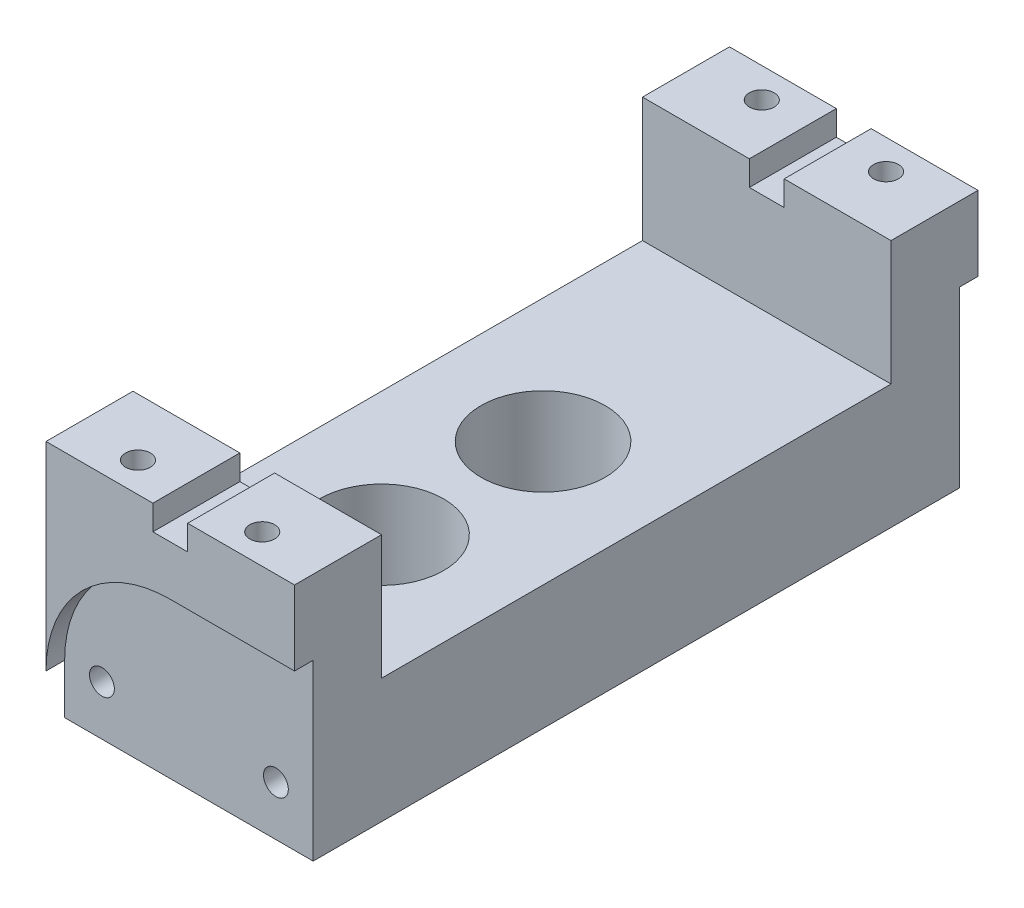
ISO-10303-21;
HEADER;
FILE_DESCRIPTION(('STEP AP214'),'2;1');
FILE_NAME('part.step','',(''),(''),'','','');
FILE_SCHEMA(('AUTOMOTIVE_DESIGN { 1 0 10303 214 1 1 1 1 }'));
ENDSEC;
DATA;
#1=APPLICATION_CONTEXT('core data for automotive mechanical design processes');
#2=APPLICATION_PROTOCOL_DEFINITION('international standard','automotive_design',2000,#1);
#3=PRODUCT_CONTEXT('',#1,'mechanical');
#4=PRODUCT('Part','Part','',(#3));
#5=PRODUCT_RELATED_PRODUCT_CATEGORY('part','',(#4));
#6=PRODUCT_DEFINITION_FORMATION('','',#4);
#7=PRODUCT_DEFINITION_CONTEXT('part definition',#1,'design');
#8=PRODUCT_DEFINITION('design','',#6,#7);
#9=PRODUCT_DEFINITION_SHAPE('','',#8);
#10=(LENGTH_UNIT() NAMED_UNIT(*) SI_UNIT(.MILLI.,.METRE.));
#11=(NAMED_UNIT(*) PLANE_ANGLE_UNIT() SI_UNIT($,.RADIAN.));
#12=(NAMED_UNIT(*) SI_UNIT($,.STERADIAN.) SOLID_ANGLE_UNIT());
#13=UNCERTAINTY_MEASURE_WITH_UNIT(LENGTH_MEASURE(1.E-05),#10,'distance_accuracy_value','');
#14=(GEOMETRIC_REPRESENTATION_CONTEXT(3) GLOBAL_UNCERTAINTY_ASSIGNED_CONTEXT((#13)) GLOBAL_UNIT_ASSIGNED_CONTEXT((#10,
#11,#12)) REPRESENTATION_CONTEXT('',''));
#15=CARTESIAN_POINT('',(0.,0.,0.));
#16=DIRECTION('',(0.,0.,1.));
#17=DIRECTION('',(1.,0.,0.));
#18=AXIS2_PLACEMENT_3D('',#15,#16,#17);
#19=CARTESIAN_POINT('',(0.,0.,0.));
#20=DIRECTION('',(0.,-1.,0.));
#21=DIRECTION('',(0.,0.,-1.));
#22=AXIS2_PLACEMENT_3D('',#19,#20,#21);
#23=PLANE('',#22);
#24=CARTESIAN_POINT('',(10.,0.,-30.));
#25=DIRECTION('',(0.,-1.,0.));
#26=DIRECTION('',(0.,0.,-1.));
#27=AXIS2_PLACEMENT_3D('',#24,#25,#26);
#28=CIRCLE('',#27,5.);
#29=CARTESIAN_POINT('',(10.,0.,-35.));
#30=VERTEX_POINT('',#29);
#31=EDGE_CURVE('E267',#30,#30,#28,.T.);
#32=ORIENTED_EDGE('',*,*,#31,.F.);
#33=EDGE_LOOP('',(#32));
#34=FACE_BOUND('',#33,.T.);
#35=CARTESIAN_POINT('',(10.,0.,-17.));
#36=DIRECTION('',(0.,-1.,0.));
#37=DIRECTION('',(0.,0.,-1.));
#38=AXIS2_PLACEMENT_3D('',#35,#36,#37);
#39=CIRCLE('',#38,5.);
#40=CARTESIAN_POINT('',(10.,0.,-22.));
#41=VERTEX_POINT('',#40);
#42=EDGE_CURVE('E271',#41,#41,#39,.T.);
#43=ORIENTED_EDGE('',*,*,#42,.F.);
#44=EDGE_LOOP('',(#43));
#45=FACE_BOUND('',#44,.T.);
#46=DIRECTION('',(0.,0.,-1.));
#47=VECTOR('',#46,1.);
#48=CARTESIAN_POINT('',(20.,0.,0.));
#49=LINE('',#48,#47);
#50=CARTESIAN_POINT('',(20.,0.,-1.5));
#51=VERTEX_POINT('',#50);
#52=CARTESIAN_POINT('',(20.,0.,-53.5));
#53=VERTEX_POINT('',#52);
#54=EDGE_CURVE('E59',#51,#53,#49,.T.);
#55=ORIENTED_EDGE('',*,*,#54,.F.);
#56=DIRECTION('',(1.,0.,0.));
#57=VECTOR('',#56,1.);
#58=CARTESIAN_POINT('',(0.,0.,-1.5));
#59=LINE('',#58,#57);
#60=CARTESIAN_POINT('',(0.,0.,-1.5));
#61=VERTEX_POINT('',#60);
#62=EDGE_CURVE('E52',#61,#51,#59,.T.);
#63=ORIENTED_EDGE('',*,*,#62,.F.);
#64=DIRECTION('',(0.,0.,1.));
#65=VECTOR('',#64,1.);
#66=CARTESIAN_POINT('',(0.,0.,0.));
#67=LINE('',#66,#65);
#68=CARTESIAN_POINT('',(0.,0.,-53.5));
#69=VERTEX_POINT('',#68);
#70=EDGE_CURVE('E210',#69,#61,#67,.T.);
#71=ORIENTED_EDGE('',*,*,#70,.F.);
#72=DIRECTION('',(-1.,0.,0.));
#73=VECTOR('',#72,1.);
#74=CARTESIAN_POINT('',(0.,0.,-53.5));
#75=LINE('',#74,#73);
#76=EDGE_CURVE('E236',#53,#69,#75,.T.);
#77=ORIENTED_EDGE('',*,*,#76,.F.);
#78=EDGE_LOOP('',(#55,#63,#71,#77));
#79=FACE_BOUND('',#78,.T.);
#80=ADVANCED_FACE('F35',(#34,#45,#79),#23,.T.);
#81=CARTESIAN_POINT('',(0.,20.,0.));
#82=DIRECTION('',(1.,0.,0.));
#83=DIRECTION('',(0.,0.,-1.));
#84=AXIS2_PLACEMENT_3D('',#81,#82,#83);
#85=PLANE('',#84);
#86=DIRECTION('',(0.,-1.,0.));
#87=VECTOR('',#86,1.);
#88=CARTESIAN_POINT('',(0.,4.,-1.5));
#89=LINE('',#88,#87);
#90=CARTESIAN_POINT('',(0.,4.,-1.5));
#91=VERTEX_POINT('',#90);
#92=EDGE_CURVE('E203',#91,#61,#89,.T.);
#93=ORIENTED_EDGE('',*,*,#92,.F.);
#94=DIRECTION('',(0.,0.,1.));
#95=VECTOR('',#94,1.);
#96=CARTESIAN_POINT('',(0.,4.,-1.5));
#97=LINE('',#96,#95);
#98=CARTESIAN_POINT('',(0.,4.,0.));
#99=VERTEX_POINT('',#98);
#100=EDGE_CURVE('E187',#91,#99,#97,.T.);
#101=ORIENTED_EDGE('',*,*,#100,.T.);
#102=DIRECTION('',(0.,-1.,0.));
#103=VECTOR('',#102,1.);
#104=CARTESIAN_POINT('',(0.,20.,0.));
#105=LINE('',#104,#103);
#106=CARTESIAN_POINT('',(0.,20.,0.));
#107=VERTEX_POINT('',#106);
#108=EDGE_CURVE('E391',#107,#99,#105,.T.);
#109=ORIENTED_EDGE('',*,*,#108,.F.);
#110=DIRECTION('',(0.,0.,1.));
#111=VECTOR('',#110,1.);
#112=CARTESIAN_POINT('',(0.,20.,0.));
#113=LINE('',#112,#111);
#114=CARTESIAN_POINT('',(0.,20.,-7.));
#115=VERTEX_POINT('',#114);
#116=EDGE_CURVE('E368',#115,#107,#113,.T.);
#117=ORIENTED_EDGE('',*,*,#116,.F.);
#118=DIRECTION('',(0.,1.,0.));
#119=VECTOR('',#118,1.);
#120=CARTESIAN_POINT('',(0.,10.,-7.));
#121=LINE('',#120,#119);
#122=CARTESIAN_POINT('',(0.,10.,-7.));
#123=VERTEX_POINT('',#122);
#124=EDGE_CURVE('E348',#123,#115,#121,.T.);
#125=ORIENTED_EDGE('',*,*,#124,.F.);
#126=DIRECTION('',(0.,0.,1.));
#127=VECTOR('',#126,1.);
#128=CARTESIAN_POINT('',(0.,10.,-48.));
#129=LINE('',#128,#127);
#130=CARTESIAN_POINT('',(0.,10.,-48.));
#131=VERTEX_POINT('',#130);
#132=EDGE_CURVE('E336',#131,#123,#129,.T.);
#133=ORIENTED_EDGE('',*,*,#132,.F.);
#134=DIRECTION('',(0.,1.,0.));
#135=VECTOR('',#134,1.);
#136=CARTESIAN_POINT('',(0.,10.,-48.));
#137=LINE('',#136,#135);
#138=CARTESIAN_POINT('',(0.,20.,-48.));
#139=VERTEX_POINT('',#138);
#140=EDGE_CURVE('E355',#131,#139,#137,.T.);
#141=ORIENTED_EDGE('',*,*,#140,.T.);
#142=CARTESIAN_POINT('',(0.,20.,-55.));
#143=VERTEX_POINT('',#142);
#144=EDGE_CURVE('E364',#143,#139,#113,.T.);
#145=ORIENTED_EDGE('',*,*,#144,.F.);
#146=DIRECTION('',(0.,-1.,0.));
#147=VECTOR('',#146,1.);
#148=CARTESIAN_POINT('',(0.,20.,-55.));
#149=LINE('',#148,#147);
#150=CARTESIAN_POINT('',(0.,4.,-55.));
#151=VERTEX_POINT('',#150);
#152=EDGE_CURVE('E380',#143,#151,#149,.T.);
#153=ORIENTED_EDGE('',*,*,#152,.T.);
#154=DIRECTION('',(0.,0.,-1.));
#155=VECTOR('',#154,1.);
#156=CARTESIAN_POINT('',(0.,4.,-53.5));
#157=LINE('',#156,#155);
#158=CARTESIAN_POINT('',(0.,4.,-53.5));
#159=VERTEX_POINT('',#158);
#160=EDGE_CURVE('E245',#159,#151,#157,.T.);
#161=ORIENTED_EDGE('',*,*,#160,.F.);
#162=DIRECTION('',(0.,1.,0.));
#163=VECTOR('',#162,1.);
#164=CARTESIAN_POINT('',(0.,4.,-53.5));
#165=LINE('',#164,#163);
#166=EDGE_CURVE('E238',#69,#159,#165,.T.);
#167=ORIENTED_EDGE('',*,*,#166,.F.);
#168=ORIENTED_EDGE('',*,*,#70,.T.);
#169=EDGE_LOOP('',(#93,#101,#109,#117,#125,#133,#141,#145,#153,#161,#167,#168));
#170=FACE_BOUND('',#169,.T.);
#171=ADVANCED_FACE('F37',(#170),#85,.F.);
#172=CARTESIAN_POINT('',(0.,20.,0.));
#173=DIRECTION('',(0.,-1.,0.));
#174=DIRECTION('',(0.,0.,-1.));
#175=AXIS2_PLACEMENT_3D('',#172,#173,#174);
#176=PLANE('',#175);
#177=CARTESIAN_POINT('',(15.,20.,-52.6));
#178=DIRECTION('',(0.,1.,0.));
#179=DIRECTION('',(0.,0.,1.));
#180=AXIS2_PLACEMENT_3D('',#177,#178,#179);
#181=CIRCLE('',#180,1.);
#182=CARTESIAN_POINT('',(15.,20.,-51.6));
#183=VERTEX_POINT('',#182);
#184=EDGE_CURVE('E278',#183,#183,#181,.T.);
#185=ORIENTED_EDGE('',*,*,#184,.F.);
#186=EDGE_LOOP('',(#185));
#187=FACE_BOUND('',#186,.T.);
#188=DIRECTION('',(-1.,0.,0.));
#189=VECTOR('',#188,1.);
#190=CARTESIAN_POINT('',(0.,20.,-55.));
#191=LINE('',#190,#189);
#192=CARTESIAN_POINT('',(20.,20.,-55.));
#193=VERTEX_POINT('',#192);
#194=CARTESIAN_POINT('',(11.4,20.,-55.));
#195=VERTEX_POINT('',#194);
#196=EDGE_CURVE('E377',#193,#195,#191,.T.);
#197=ORIENTED_EDGE('',*,*,#196,.T.);
#198=DIRECTION('',(0.,0.,-1.));
#199=VECTOR('',#198,1.);
#200=CARTESIAN_POINT('',(11.4,20.,0.));
#201=LINE('',#200,#199);
#202=CARTESIAN_POINT('',(11.4,20.,-48.));
#203=VERTEX_POINT('',#202);
#204=EDGE_CURVE('E297',#203,#195,#201,.T.);
#205=ORIENTED_EDGE('',*,*,#204,.F.);
#206=DIRECTION('',(-1.,0.,0.));
#207=VECTOR('',#206,1.);
#208=CARTESIAN_POINT('',(20.,20.,-48.));
#209=LINE('',#208,#207);
#210=CARTESIAN_POINT('',(20.,20.,-48.));
#211=VERTEX_POINT('',#210);
#212=EDGE_CURVE('E340',#211,#203,#209,.T.);
#213=ORIENTED_EDGE('',*,*,#212,.F.);
#214=DIRECTION('',(0.,0.,-1.));
#215=VECTOR('',#214,1.);
#216=CARTESIAN_POINT('',(20.,20.,0.));
#217=LINE('',#216,#215);
#218=EDGE_CURVE('E372',#211,#193,#217,.T.);
#219=ORIENTED_EDGE('',*,*,#218,.T.);
#220=EDGE_LOOP('',(#197,#205,#213,#219));
#221=FACE_BOUND('',#220,.T.);
#222=ADVANCED_FACE('F427',(#187,#221),#176,.F.);
#223=CARTESIAN_POINT('',(15.,20.,-2.4));
#224=DIRECTION('',(0.,1.,0.));
#225=DIRECTION('',(0.,0.,1.));
#226=AXIS2_PLACEMENT_3D('',#223,#224,#225);
#227=CIRCLE('',#226,1.);
#228=CARTESIAN_POINT('',(15.,20.,-1.4));
#229=VERTEX_POINT('',#228);
#230=EDGE_CURVE('E285',#229,#229,#227,.T.);
#231=ORIENTED_EDGE('',*,*,#230,.F.);
#232=EDGE_LOOP('',(#231));
#233=FACE_BOUND('',#232,.T.);
#234=DIRECTION('',(1.,0.,0.));
#235=VECTOR('',#234,1.);
#236=CARTESIAN_POINT('',(20.,20.,-7.));
#237=LINE('',#236,#235);
#238=CARTESIAN_POINT('',(11.4,20.,-7.));
#239=VERTEX_POINT('',#238);
#240=CARTESIAN_POINT('',(20.,20.,-7.));
#241=VERTEX_POINT('',#240);
#242=EDGE_CURVE('E335',#239,#241,#237,.T.);
#243=ORIENTED_EDGE('',*,*,#242,.F.);
#244=CARTESIAN_POINT('',(11.4,20.,0.));
#245=VERTEX_POINT('',#244);
#246=EDGE_CURVE('E313',#245,#239,#201,.T.);
#247=ORIENTED_EDGE('',*,*,#246,.F.);
#248=DIRECTION('',(1.,0.,0.));
#249=VECTOR('',#248,1.);
#250=CARTESIAN_POINT('',(0.,20.,0.));
#251=LINE('',#250,#249);
#252=CARTESIAN_POINT('',(20.,20.,0.));
#253=VERTEX_POINT('',#252);
#254=EDGE_CURVE('E367',#245,#253,#251,.T.);
#255=ORIENTED_EDGE('',*,*,#254,.T.);
#256=EDGE_CURVE('E373',#253,#241,#217,.T.);
#257=ORIENTED_EDGE('',*,*,#256,.T.);
#258=EDGE_LOOP('',(#243,#247,#255,#257));
#259=FACE_BOUND('',#258,.T.);
#260=ADVANCED_FACE('F447',(#233,#259),#176,.F.);
#261=CARTESIAN_POINT('',(5.,20.,-52.6));
#262=DIRECTION('',(0.,1.,0.));
#263=DIRECTION('',(0.,0.,1.));
#264=AXIS2_PLACEMENT_3D('',#261,#262,#263);
#265=CIRCLE('',#264,1.);
#266=CARTESIAN_POINT('',(5.,20.,-51.6));
#267=VERTEX_POINT('',#266);
#268=EDGE_CURVE('E279',#267,#267,#265,.T.);
#269=ORIENTED_EDGE('',*,*,#268,.F.);
#270=EDGE_LOOP('',(#269));
#271=FACE_BOUND('',#270,.T.);
#272=CARTESIAN_POINT('',(8.6,20.,-48.));
#273=VERTEX_POINT('',#272);
#274=EDGE_CURVE('E352',#273,#139,#209,.T.);
#275=ORIENTED_EDGE('',*,*,#274,.F.);
#276=DIRECTION('',(0.,0.,1.));
#277=VECTOR('',#276,1.);
#278=CARTESIAN_POINT('',(8.6,20.,-55.));
#279=LINE('',#278,#277);
#280=CARTESIAN_POINT('',(8.6,20.,-55.));
#281=VERTEX_POINT('',#280);
#282=EDGE_CURVE('E316',#281,#273,#279,.T.);
#283=ORIENTED_EDGE('',*,*,#282,.F.);
#284=EDGE_CURVE('E376',#281,#143,#191,.T.);
#285=ORIENTED_EDGE('',*,*,#284,.T.);
#286=ORIENTED_EDGE('',*,*,#144,.T.);
#287=EDGE_LOOP('',(#275,#283,#285,#286));
#288=FACE_BOUND('',#287,.T.);
#289=ADVANCED_FACE('F442',(#271,#288),#176,.F.);
#290=CARTESIAN_POINT('',(0.,20.,0.));
#291=DIRECTION('',(0.,0.,-1.));
#292=DIRECTION('',(-1.,0.,0.));
#293=AXIS2_PLACEMENT_3D('',#290,#291,#292);
#294=PLANE('',#293);
#295=ORIENTED_EDGE('',*,*,#108,.T.);
#296=CARTESIAN_POINT('',(10.,4.,0.));
#297=DIRECTION('',(0.,0.,1.));
#298=DIRECTION('',(1.,0.,0.));
#299=AXIS2_PLACEMENT_3D('',#296,#297,#298);
#300=CIRCLE('',#299,10.);
#301=CARTESIAN_POINT('',(10.,14.,0.));
#302=VERTEX_POINT('',#301);
#303=EDGE_CURVE('E193',#302,#99,#300,.T.);
#304=ORIENTED_EDGE('',*,*,#303,.F.);
#305=DIRECTION('',(-1.,0.,0.));
#306=VECTOR('',#305,1.);
#307=CARTESIAN_POINT('',(10.,14.,0.));
#308=LINE('',#307,#306);
#309=CARTESIAN_POINT('',(20.,14.,0.));
#310=VERTEX_POINT('',#309);
#311=EDGE_CURVE('E205',#310,#302,#308,.T.);
#312=ORIENTED_EDGE('',*,*,#311,.F.);
#313=DIRECTION('',(0.,-1.,0.));
#314=VECTOR('',#313,1.);
#315=CARTESIAN_POINT('',(20.,20.,0.));
#316=LINE('',#315,#314);
#317=EDGE_CURVE('E388',#253,#310,#316,.T.);
#318=ORIENTED_EDGE('',*,*,#317,.F.);
#319=ORIENTED_EDGE('',*,*,#254,.F.);
#320=DIRECTION('',(0.,1.,0.));
#321=VECTOR('',#320,1.);
#322=CARTESIAN_POINT('',(11.4,18.,0.));
#323=LINE('',#322,#321);
#324=CARTESIAN_POINT('',(11.4,18.,0.));
#325=VERTEX_POINT('',#324);
#326=EDGE_CURVE('E318',#325,#245,#323,.T.);
#327=ORIENTED_EDGE('',*,*,#326,.F.);
#328=DIRECTION('',(1.,0.,0.));
#329=VECTOR('',#328,1.);
#330=CARTESIAN_POINT('',(8.6,18.,0.));
#331=LINE('',#330,#329);
#332=CARTESIAN_POINT('',(8.6,18.,0.));
#333=VERTEX_POINT('',#332);
#334=EDGE_CURVE('E309',#333,#325,#331,.T.);
#335=ORIENTED_EDGE('',*,*,#334,.F.);
#336=DIRECTION('',(0.,1.,0.));
#337=VECTOR('',#336,1.);
#338=CARTESIAN_POINT('',(8.6,18.,0.));
#339=LINE('',#338,#337);
#340=CARTESIAN_POINT('',(8.6,20.,0.));
#341=VERTEX_POINT('',#340);
#342=EDGE_CURVE('E321',#333,#341,#339,.T.);
#343=ORIENTED_EDGE('',*,*,#342,.T.);
#344=EDGE_CURVE('E369',#107,#341,#251,.T.);
#345=ORIENTED_EDGE('',*,*,#344,.F.);
#346=EDGE_LOOP('',(#295,#304,#312,#318,#319,#327,#335,#343,#345));
#347=FACE_BOUND('',#346,.T.);
#348=ADVANCED_FACE('F440',(#347),#294,.F.);
#349=CARTESIAN_POINT('',(20.,20.,0.));
#350=DIRECTION('',(-1.,0.,0.));
#351=DIRECTION('',(0.,0.,1.));
#352=AXIS2_PLACEMENT_3D('',#349,#350,#351);
#353=PLANE('',#352);
#354=ORIENTED_EDGE('',*,*,#317,.T.);
#355=DIRECTION('',(0.,0.,1.));
#356=VECTOR('',#355,1.);
#357=CARTESIAN_POINT('',(20.,14.,-1.5));
#358=LINE('',#357,#356);
#359=CARTESIAN_POINT('',(20.,14.,-1.5));
#360=VERTEX_POINT('',#359);
#361=EDGE_CURVE('E198',#360,#310,#358,.T.);
#362=ORIENTED_EDGE('',*,*,#361,.F.);
#363=DIRECTION('',(0.,1.,0.));
#364=VECTOR('',#363,1.);
#365=CARTESIAN_POINT('',(20.,14.,-1.5));
#366=LINE('',#365,#364);
#367=EDGE_CURVE('E212',#51,#360,#366,.T.);
#368=ORIENTED_EDGE('',*,*,#367,.F.);
#369=ORIENTED_EDGE('',*,*,#54,.T.);
#370=DIRECTION('',(0.,-1.,0.));
#371=VECTOR('',#370,1.);
#372=CARTESIAN_POINT('',(20.,14.,-53.5));
#373=LINE('',#372,#371);
#374=CARTESIAN_POINT('',(20.,14.,-53.5));
#375=VERTEX_POINT('',#374);
#376=EDGE_CURVE('E234',#375,#53,#373,.T.);
#377=ORIENTED_EDGE('',*,*,#376,.F.);
#378=DIRECTION('',(0.,0.,-1.));
#379=VECTOR('',#378,1.);
#380=CARTESIAN_POINT('',(20.,14.,-53.5));
#381=LINE('',#380,#379);
#382=CARTESIAN_POINT('',(20.,14.,-55.));
#383=VERTEX_POINT('',#382);
#384=EDGE_CURVE('E248',#375,#383,#381,.T.);
#385=ORIENTED_EDGE('',*,*,#384,.T.);
#386=DIRECTION('',(0.,-1.,0.));
#387=VECTOR('',#386,1.);
#388=CARTESIAN_POINT('',(20.,20.,-55.));
#389=LINE('',#388,#387);
#390=EDGE_CURVE('E385',#193,#383,#389,.T.);
#391=ORIENTED_EDGE('',*,*,#390,.F.);
#392=ORIENTED_EDGE('',*,*,#218,.F.);
#393=DIRECTION('',(0.,1.,0.));
#394=VECTOR('',#393,1.);
#395=CARTESIAN_POINT('',(20.,10.,-48.));
#396=LINE('',#395,#394);
#397=CARTESIAN_POINT('',(20.,10.,-48.));
#398=VERTEX_POINT('',#397);
#399=EDGE_CURVE('E358',#398,#211,#396,.T.);
#400=ORIENTED_EDGE('',*,*,#399,.F.);
#401=DIRECTION('',(0.,0.,-1.));
#402=VECTOR('',#401,1.);
#403=CARTESIAN_POINT('',(20.,10.,-48.));
#404=LINE('',#403,#402);
#405=CARTESIAN_POINT('',(20.,10.,-7.));
#406=VERTEX_POINT('',#405);
#407=EDGE_CURVE('E343',#406,#398,#404,.T.);
#408=ORIENTED_EDGE('',*,*,#407,.F.);
#409=DIRECTION('',(0.,1.,0.));
#410=VECTOR('',#409,1.);
#411=CARTESIAN_POINT('',(20.,10.,-7.));
#412=LINE('',#411,#410);
#413=EDGE_CURVE('E360',#406,#241,#412,.T.);
#414=ORIENTED_EDGE('',*,*,#413,.T.);
#415=ORIENTED_EDGE('',*,*,#256,.F.);
#416=EDGE_LOOP('',(#354,#362,#368,#369,#377,#385,#391,#392,#400,#408,#414,#415));
#417=FACE_BOUND('',#416,.T.);
#418=ADVANCED_FACE('F437',(#417),#353,.F.);
#419=CARTESIAN_POINT('',(0.,20.,-55.));
#420=DIRECTION('',(0.,0.,1.));
#421=DIRECTION('',(1.,0.,0.));
#422=AXIS2_PLACEMENT_3D('',#419,#420,#421);
#423=PLANE('',#422);
#424=DIRECTION('',(1.,0.,0.));
#425=VECTOR('',#424,1.);
#426=CARTESIAN_POINT('',(10.,14.,-55.));
#427=LINE('',#426,#425);
#428=CARTESIAN_POINT('',(10.,14.,-55.));
#429=VERTEX_POINT('',#428);
#430=EDGE_CURVE('E231',#429,#383,#427,.T.);
#431=ORIENTED_EDGE('',*,*,#430,.F.);
#432=CARTESIAN_POINT('',(10.,4.,-55.));
#433=DIRECTION('',(0.,0.,-1.));
#434=DIRECTION('',(-1.,0.,0.));
#435=AXIS2_PLACEMENT_3D('',#432,#433,#434);
#436=CIRCLE('',#435,10.);
#437=EDGE_CURVE('E226',#151,#429,#436,.T.);
#438=ORIENTED_EDGE('',*,*,#437,.F.);
#439=ORIENTED_EDGE('',*,*,#152,.F.);
#440=ORIENTED_EDGE('',*,*,#284,.F.);
#441=DIRECTION('',(0.,1.,0.));
#442=VECTOR('',#441,1.);
#443=CARTESIAN_POINT('',(8.6,18.,-55.));
#444=LINE('',#443,#442);
#445=CARTESIAN_POINT('',(8.6,18.,-55.));
#446=VERTEX_POINT('',#445);
#447=EDGE_CURVE('E324',#446,#281,#444,.T.);
#448=ORIENTED_EDGE('',*,*,#447,.F.);
#449=DIRECTION('',(-1.,0.,0.));
#450=VECTOR('',#449,1.);
#451=CARTESIAN_POINT('',(11.4,18.,-55.));
#452=LINE('',#451,#450);
#453=CARTESIAN_POINT('',(11.4,18.,-55.));
#454=VERTEX_POINT('',#453);
#455=EDGE_CURVE('E302',#454,#446,#452,.T.);
#456=ORIENTED_EDGE('',*,*,#455,.F.);
#457=DIRECTION('',(0.,1.,0.));
#458=VECTOR('',#457,1.);
#459=CARTESIAN_POINT('',(11.4,18.,-55.));
#460=LINE('',#459,#458);
#461=EDGE_CURVE('E312',#454,#195,#460,.T.);
#462=ORIENTED_EDGE('',*,*,#461,.T.);
#463=ORIENTED_EDGE('',*,*,#196,.F.);
#464=ORIENTED_EDGE('',*,*,#390,.T.);
#465=EDGE_LOOP('',(#431,#438,#439,#440,#448,#456,#462,#463,#464));
#466=FACE_BOUND('',#465,.T.);
#467=ADVANCED_FACE('F434',(#466),#423,.F.);
#468=CARTESIAN_POINT('',(5.,20.,-2.4));
#469=DIRECTION('',(0.,1.,0.));
#470=DIRECTION('',(0.,0.,1.));
#471=AXIS2_PLACEMENT_3D('',#468,#469,#470);
#472=CIRCLE('',#471,1.);
#473=CARTESIAN_POINT('',(5.,20.,-1.4));
#474=VERTEX_POINT('',#473);
#475=EDGE_CURVE('E291',#474,#474,#472,.T.);
#476=ORIENTED_EDGE('',*,*,#475,.F.);
#477=EDGE_LOOP('',(#476));
#478=FACE_BOUND('',#477,.T.);
#479=ORIENTED_EDGE('',*,*,#344,.T.);
#480=CARTESIAN_POINT('',(8.6,20.,-7.));
#481=VERTEX_POINT('',#480);
#482=EDGE_CURVE('E315',#481,#341,#279,.T.);
#483=ORIENTED_EDGE('',*,*,#482,.F.);
#484=EDGE_CURVE('E349',#115,#481,#237,.T.);
#485=ORIENTED_EDGE('',*,*,#484,.F.);
#486=ORIENTED_EDGE('',*,*,#116,.T.);
#487=EDGE_LOOP('',(#479,#483,#485,#486));
#488=FACE_BOUND('',#487,.T.);
#489=ADVANCED_FACE('F432',(#478,#488),#176,.F.);
#490=CARTESIAN_POINT('',(20.,10.,-48.));
#491=DIRECTION('',(0.,0.,-1.));
#492=DIRECTION('',(-1.,0.,0.));
#493=AXIS2_PLACEMENT_3D('',#490,#491,#492);
#494=PLANE('',#493);
#495=ORIENTED_EDGE('',*,*,#212,.T.);
#496=DIRECTION('',(0.,-1.,0.));
#497=VECTOR('',#496,1.);
#498=CARTESIAN_POINT('',(11.4,10.,-48.));
#499=LINE('',#498,#497);
#500=CARTESIAN_POINT('',(11.4,18.,-48.));
#501=VERTEX_POINT('',#500);
#502=EDGE_CURVE('E332',#203,#501,#499,.T.);
#503=ORIENTED_EDGE('',*,*,#502,.T.);
#504=DIRECTION('',(1.,0.,0.));
#505=VECTOR('',#504,1.);
#506=CARTESIAN_POINT('',(20.,18.,-48.));
#507=LINE('',#506,#505);
#508=CARTESIAN_POINT('',(8.6,18.,-48.));
#509=VERTEX_POINT('',#508);
#510=EDGE_CURVE('E320',#509,#501,#507,.T.);
#511=ORIENTED_EDGE('',*,*,#510,.F.);
#512=DIRECTION('',(0.,1.,0.));
#513=VECTOR('',#512,1.);
#514=CARTESIAN_POINT('',(8.6,10.,-48.));
#515=LINE('',#514,#513);
#516=EDGE_CURVE('E329',#509,#273,#515,.T.);
#517=ORIENTED_EDGE('',*,*,#516,.T.);
#518=ORIENTED_EDGE('',*,*,#274,.T.);
#519=ORIENTED_EDGE('',*,*,#140,.F.);
#520=DIRECTION('',(-1.,0.,0.));
#521=VECTOR('',#520,1.);
#522=CARTESIAN_POINT('',(20.,10.,-48.));
#523=LINE('',#522,#521);
#524=EDGE_CURVE('E345',#398,#131,#523,.T.);
#525=ORIENTED_EDGE('',*,*,#524,.F.);
#526=ORIENTED_EDGE('',*,*,#399,.T.);
#527=EDGE_LOOP('',(#495,#503,#511,#517,#518,#519,#525,#526));
#528=FACE_BOUND('',#527,.T.);
#529=ADVANCED_FACE('F491',(#528),#494,.F.);
#530=CARTESIAN_POINT('',(20.,10.,-7.));
#531=DIRECTION('',(0.,0.,1.));
#532=DIRECTION('',(1.,0.,0.));
#533=AXIS2_PLACEMENT_3D('',#530,#531,#532);
#534=PLANE('',#533);
#535=DIRECTION('',(-1.,0.,0.));
#536=VECTOR('',#535,1.);
#537=CARTESIAN_POINT('',(20.,18.,-7.));
#538=LINE('',#537,#536);
#539=CARTESIAN_POINT('',(11.4,18.,-7.));
#540=VERTEX_POINT('',#539);
#541=CARTESIAN_POINT('',(8.6,18.,-7.));
#542=VERTEX_POINT('',#541);
#543=EDGE_CURVE('E393',#540,#542,#538,.T.);
#544=ORIENTED_EDGE('',*,*,#543,.F.);
#545=DIRECTION('',(0.,1.,0.));
#546=VECTOR('',#545,1.);
#547=CARTESIAN_POINT('',(11.4,10.,-7.));
#548=LINE('',#547,#546);
#549=EDGE_CURVE('E11',#540,#239,#548,.T.);
#550=ORIENTED_EDGE('',*,*,#549,.T.);
#551=ORIENTED_EDGE('',*,*,#242,.T.);
#552=ORIENTED_EDGE('',*,*,#413,.F.);
#553=DIRECTION('',(1.,0.,0.));
#554=VECTOR('',#553,1.);
#555=CARTESIAN_POINT('',(20.,10.,-7.));
#556=LINE('',#555,#554);
#557=EDGE_CURVE('E339',#123,#406,#556,.T.);
#558=ORIENTED_EDGE('',*,*,#557,.F.);
#559=ORIENTED_EDGE('',*,*,#124,.T.);
#560=ORIENTED_EDGE('',*,*,#484,.T.);
#561=DIRECTION('',(0.,-1.,0.));
#562=VECTOR('',#561,1.);
#563=CARTESIAN_POINT('',(8.6,10.,-7.));
#564=LINE('',#563,#562);
#565=EDGE_CURVE('E44',#481,#542,#564,.T.);
#566=ORIENTED_EDGE('',*,*,#565,.T.);
#567=EDGE_LOOP('',(#544,#550,#551,#552,#558,#559,#560,#566));
#568=FACE_BOUND('',#567,.T.);
#569=ADVANCED_FACE('F459',(#568),#534,.F.);
#570=CARTESIAN_POINT('',(0.,10.,0.));
#571=DIRECTION('',(0.,-1.,0.));
#572=DIRECTION('',(0.,0.,-1.));
#573=AXIS2_PLACEMENT_3D('',#570,#571,#572);
#574=PLANE('',#573);
#575=CARTESIAN_POINT('',(10.,10.,-30.));
#576=DIRECTION('',(0.,-1.,0.));
#577=DIRECTION('',(0.,0.,-1.));
#578=AXIS2_PLACEMENT_3D('',#575,#576,#577);
#579=CIRCLE('',#578,5.);
#580=CARTESIAN_POINT('',(10.,10.,-35.));
#581=VERTEX_POINT('',#580);
#582=EDGE_CURVE('E270',#581,#581,#579,.T.);
#583=ORIENTED_EDGE('',*,*,#582,.T.);
#584=EDGE_LOOP('',(#583));
#585=FACE_BOUND('',#584,.T.);
#586=CARTESIAN_POINT('',(10.,10.,-17.));
#587=DIRECTION('',(0.,-1.,0.));
#588=DIRECTION('',(0.,0.,-1.));
#589=AXIS2_PLACEMENT_3D('',#586,#587,#588);
#590=CIRCLE('',#589,5.);
#591=CARTESIAN_POINT('',(10.,10.,-22.));
#592=VERTEX_POINT('',#591);
#593=EDGE_CURVE('E274',#592,#592,#590,.T.);
#594=ORIENTED_EDGE('',*,*,#593,.T.);
#595=EDGE_LOOP('',(#594));
#596=FACE_BOUND('',#595,.T.);
#597=ORIENTED_EDGE('',*,*,#132,.T.);
#598=ORIENTED_EDGE('',*,*,#557,.T.);
#599=ORIENTED_EDGE('',*,*,#407,.T.);
#600=ORIENTED_EDGE('',*,*,#524,.T.);
#601=EDGE_LOOP('',(#597,#598,#599,#600));
#602=FACE_BOUND('',#601,.T.);
#603=ADVANCED_FACE('F462',(#585,#596,#602),#574,.F.);
#604=CARTESIAN_POINT('',(0.,18.,0.));
#605=DIRECTION('',(0.,1.,0.));
#606=DIRECTION('',(0.,0.,1.));
#607=AXIS2_PLACEMENT_3D('',#604,#605,#606);
#608=PLANE('',#607);
#609=ORIENTED_EDGE('',*,*,#543,.T.);
#610=DIRECTION('',(0.,0.,1.));
#611=VECTOR('',#610,1.);
#612=CARTESIAN_POINT('',(8.6,18.,-55.));
#613=LINE('',#612,#611);
#614=EDGE_CURVE('E306',#542,#333,#613,.T.);
#615=ORIENTED_EDGE('',*,*,#614,.T.);
#616=ORIENTED_EDGE('',*,*,#334,.T.);
#617=DIRECTION('',(0.,0.,-1.));
#618=VECTOR('',#617,1.);
#619=CARTESIAN_POINT('',(11.4,18.,0.));
#620=LINE('',#619,#618);
#621=EDGE_CURVE('E300',#325,#540,#620,.T.);
#622=ORIENTED_EDGE('',*,*,#621,.T.);
#623=EDGE_LOOP('',(#609,#615,#616,#622));
#624=FACE_BOUND('',#623,.T.);
#625=ADVANCED_FACE('F510',(#624),#608,.T.);
#626=CARTESIAN_POINT('',(8.6,18.,-55.));
#627=DIRECTION('',(-1.,0.,0.));
#628=DIRECTION('',(0.,0.,1.));
#629=AXIS2_PLACEMENT_3D('',#626,#627,#628);
#630=PLANE('',#629);
#631=ORIENTED_EDGE('',*,*,#482,.T.);
#632=ORIENTED_EDGE('',*,*,#342,.F.);
#633=ORIENTED_EDGE('',*,*,#614,.F.);
#634=ORIENTED_EDGE('',*,*,#565,.F.);
#635=EDGE_LOOP('',(#631,#632,#633,#634));
#636=FACE_BOUND('',#635,.T.);
#637=ADVANCED_FACE('F503',(#636),#630,.F.);
#638=CARTESIAN_POINT('',(11.4,18.,0.));
#639=DIRECTION('',(1.,0.,0.));
#640=DIRECTION('',(0.,0.,-1.));
#641=AXIS2_PLACEMENT_3D('',#638,#639,#640);
#642=PLANE('',#641);
#643=ORIENTED_EDGE('',*,*,#621,.F.);
#644=ORIENTED_EDGE('',*,*,#326,.T.);
#645=ORIENTED_EDGE('',*,*,#246,.T.);
#646=ORIENTED_EDGE('',*,*,#549,.F.);
#647=EDGE_LOOP('',(#643,#644,#645,#646));
#648=FACE_BOUND('',#647,.T.);
#649=ADVANCED_FACE('F511',(#648),#642,.F.);
#650=ORIENTED_EDGE('',*,*,#204,.T.);
#651=ORIENTED_EDGE('',*,*,#461,.F.);
#652=EDGE_CURVE('E303',#501,#454,#620,.T.);
#653=ORIENTED_EDGE('',*,*,#652,.F.);
#654=ORIENTED_EDGE('',*,*,#502,.F.);
#655=EDGE_LOOP('',(#650,#651,#653,#654));
#656=FACE_BOUND('',#655,.T.);
#657=ADVANCED_FACE('F495',(#656),#642,.F.);
#658=EDGE_CURVE('E307',#446,#509,#613,.T.);
#659=ORIENTED_EDGE('',*,*,#658,.F.);
#660=ORIENTED_EDGE('',*,*,#447,.T.);
#661=ORIENTED_EDGE('',*,*,#282,.T.);
#662=ORIENTED_EDGE('',*,*,#516,.F.);
#663=EDGE_LOOP('',(#659,#660,#661,#662));
#664=FACE_BOUND('',#663,.T.);
#665=ADVANCED_FACE('F500',(#664),#630,.F.);
#666=ORIENTED_EDGE('',*,*,#510,.T.);
#667=ORIENTED_EDGE('',*,*,#652,.T.);
#668=ORIENTED_EDGE('',*,*,#455,.T.);
#669=ORIENTED_EDGE('',*,*,#658,.T.);
#670=EDGE_LOOP('',(#666,#667,#668,#669));
#671=FACE_BOUND('',#670,.T.);
#672=ADVANCED_FACE('F497',(#671),#608,.T.);
#673=CARTESIAN_POINT('',(15.,16.,-52.6));
#674=DIRECTION('',(0.,1.,0.));
#675=DIRECTION('',(0.,0.,1.));
#676=AXIS2_PLACEMENT_3D('',#673,#674,#675);
#677=CYLINDRICAL_SURFACE('',#676,1.);
#678=CARTESIAN_POINT('',(15.,16.,-52.6));
#679=DIRECTION('',(0.,1.,0.));
#680=DIRECTION('',(0.,0.,1.));
#681=AXIS2_PLACEMENT_3D('',#678,#679,#680);
#682=CIRCLE('',#681,1.);
#683=CARTESIAN_POINT('',(15.,16.,-51.6));
#684=VERTEX_POINT('',#683);
#685=EDGE_CURVE('E294',#684,#684,#682,.T.);
#686=ORIENTED_EDGE('',*,*,#685,.F.);
#687=EDGE_LOOP('',(#686));
#688=FACE_BOUND('',#687,.T.);
#689=ORIENTED_EDGE('',*,*,#184,.T.);
#690=EDGE_LOOP('',(#689));
#691=FACE_BOUND('',#690,.T.);
#692=ADVANCED_FACE('F508',(#688,#691),#677,.F.);
#693=CARTESIAN_POINT('',(15.,16.,-52.6));
#694=DIRECTION('',(0.,1.,0.));
#695=DIRECTION('',(0.,0.,1.));
#696=AXIS2_PLACEMENT_3D('',#693,#694,#695);
#697=PLANE('',#696);
#698=ORIENTED_EDGE('',*,*,#685,.T.);
#699=EDGE_LOOP('',(#698));
#700=FACE_BOUND('',#699,.T.);
#701=ADVANCED_FACE('F667',(#700),#697,.T.);
#702=CARTESIAN_POINT('',(5.,16.,-2.4));
#703=DIRECTION('',(0.,1.,0.));
#704=DIRECTION('',(0.,0.,1.));
#705=AXIS2_PLACEMENT_3D('',#702,#703,#704);
#706=CYLINDRICAL_SURFACE('',#705,1.);
#707=CARTESIAN_POINT('',(5.,16.,-2.4));
#708=DIRECTION('',(0.,1.,0.));
#709=DIRECTION('',(0.,0.,1.));
#710=AXIS2_PLACEMENT_3D('',#707,#708,#709);
#711=CIRCLE('',#710,1.);
#712=CARTESIAN_POINT('',(5.,16.,-1.4));
#713=VERTEX_POINT('',#712);
#714=EDGE_CURVE('E288',#713,#713,#711,.T.);
#715=ORIENTED_EDGE('',*,*,#714,.F.);
#716=EDGE_LOOP('',(#715));
#717=FACE_BOUND('',#716,.T.);
#718=ORIENTED_EDGE('',*,*,#475,.T.);
#719=EDGE_LOOP('',(#718));
#720=FACE_BOUND('',#719,.T.);
#721=ADVANCED_FACE('F678',(#717,#720),#706,.F.);
#722=CARTESIAN_POINT('',(5.,16.,-2.4));
#723=DIRECTION('',(0.,1.,0.));
#724=DIRECTION('',(0.,0.,1.));
#725=AXIS2_PLACEMENT_3D('',#722,#723,#724);
#726=PLANE('',#725);
#727=ORIENTED_EDGE('',*,*,#714,.T.);
#728=EDGE_LOOP('',(#727));
#729=FACE_BOUND('',#728,.T.);
#730=ADVANCED_FACE('F688',(#729),#726,.T.);
#731=CARTESIAN_POINT('',(5.,16.,-52.6));
#732=DIRECTION('',(0.,1.,0.));
#733=DIRECTION('',(0.,0.,1.));
#734=AXIS2_PLACEMENT_3D('',#731,#732,#733);
#735=CYLINDRICAL_SURFACE('',#734,1.);
#736=CARTESIAN_POINT('',(5.,16.,-52.6));
#737=DIRECTION('',(0.,1.,0.));
#738=DIRECTION('',(0.,0.,1.));
#739=AXIS2_PLACEMENT_3D('',#736,#737,#738);
#740=CIRCLE('',#739,1.);
#741=CARTESIAN_POINT('',(5.,16.,-51.6));
#742=VERTEX_POINT('',#741);
#743=EDGE_CURVE('E275',#742,#742,#740,.T.);
#744=ORIENTED_EDGE('',*,*,#743,.F.);
#745=EDGE_LOOP('',(#744));
#746=FACE_BOUND('',#745,.T.);
#747=ORIENTED_EDGE('',*,*,#268,.T.);
#748=EDGE_LOOP('',(#747));
#749=FACE_BOUND('',#748,.T.);
#750=ADVANCED_FACE('F698',(#746,#749),#735,.F.);
#751=CARTESIAN_POINT('',(5.,16.,-52.6));
#752=DIRECTION('',(0.,1.,0.));
#753=DIRECTION('',(0.,0.,1.));
#754=AXIS2_PLACEMENT_3D('',#751,#752,#753);
#755=PLANE('',#754);
#756=ORIENTED_EDGE('',*,*,#743,.T.);
#757=EDGE_LOOP('',(#756));
#758=FACE_BOUND('',#757,.T.);
#759=ADVANCED_FACE('F708',(#758),#755,.T.);
#760=CARTESIAN_POINT('',(15.,16.,-2.4));
#761=DIRECTION('',(0.,1.,0.));
#762=DIRECTION('',(0.,0.,1.));
#763=AXIS2_PLACEMENT_3D('',#760,#761,#762);
#764=CYLINDRICAL_SURFACE('',#763,1.);
#765=CARTESIAN_POINT('',(15.,16.,-2.4));
#766=DIRECTION('',(0.,1.,0.));
#767=DIRECTION('',(0.,0.,1.));
#768=AXIS2_PLACEMENT_3D('',#765,#766,#767);
#769=CIRCLE('',#768,1.);
#770=CARTESIAN_POINT('',(15.,16.,-1.4));
#771=VERTEX_POINT('',#770);
#772=EDGE_CURVE('E282',#771,#771,#769,.T.);
#773=ORIENTED_EDGE('',*,*,#772,.F.);
#774=EDGE_LOOP('',(#773));
#775=FACE_BOUND('',#774,.T.);
#776=ORIENTED_EDGE('',*,*,#230,.T.);
#777=EDGE_LOOP('',(#776));
#778=FACE_BOUND('',#777,.T.);
#779=ADVANCED_FACE('F718',(#775,#778),#764,.F.);
#780=CARTESIAN_POINT('',(15.,16.,-2.4));
#781=DIRECTION('',(0.,1.,0.));
#782=DIRECTION('',(0.,0.,1.));
#783=AXIS2_PLACEMENT_3D('',#780,#781,#782);
#784=PLANE('',#783);
#785=ORIENTED_EDGE('',*,*,#772,.T.);
#786=EDGE_LOOP('',(#785));
#787=FACE_BOUND('',#786,.T.);
#788=ADVANCED_FACE('F728',(#787),#784,.T.);
#789=CARTESIAN_POINT('',(10.,20.,-17.));
#790=DIRECTION('',(0.,-1.,0.));
#791=DIRECTION('',(0.,0.,-1.));
#792=AXIS2_PLACEMENT_3D('',#789,#790,#791);
#793=CYLINDRICAL_SURFACE('',#792,5.);
#794=ORIENTED_EDGE('',*,*,#42,.T.);
#795=EDGE_LOOP('',(#794));
#796=FACE_BOUND('',#795,.T.);
#797=ORIENTED_EDGE('',*,*,#593,.F.);
#798=EDGE_LOOP('',(#797));
#799=FACE_BOUND('',#798,.T.);
#800=ADVANCED_FACE('F738',(#796,#799),#793,.F.);
#801=CARTESIAN_POINT('',(10.,20.,-30.));
#802=DIRECTION('',(0.,-1.,0.));
#803=DIRECTION('',(0.,0.,-1.));
#804=AXIS2_PLACEMENT_3D('',#801,#802,#803);
#805=CYLINDRICAL_SURFACE('',#804,5.);
#806=ORIENTED_EDGE('',*,*,#31,.T.);
#807=EDGE_LOOP('',(#806));
#808=FACE_BOUND('',#807,.T.);
#809=ORIENTED_EDGE('',*,*,#582,.F.);
#810=EDGE_LOOP('',(#809));
#811=FACE_BOUND('',#810,.T.);
#812=ADVANCED_FACE('F549',(#808,#811),#805,.F.);
#813=CARTESIAN_POINT('',(10.,4.,-53.5));
#814=DIRECTION('',(0.,0.,-1.));
#815=DIRECTION('',(-1.,0.,0.));
#816=AXIS2_PLACEMENT_3D('',#813,#814,#815);
#817=PLANE('',#816);
#818=CARTESIAN_POINT('',(10.,4.,-53.5));
#819=DIRECTION('',(0.,0.,-1.));
#820=DIRECTION('',(-1.,0.,0.));
#821=AXIS2_PLACEMENT_3D('',#818,#819,#820);
#822=CIRCLE('',#821,10.);
#823=CARTESIAN_POINT('',(10.,14.,-53.5));
#824=VERTEX_POINT('',#823);
#825=EDGE_CURVE('E227',#159,#824,#822,.T.);
#826=ORIENTED_EDGE('',*,*,#825,.T.);
#827=DIRECTION('',(1.,0.,0.));
#828=VECTOR('',#827,1.);
#829=CARTESIAN_POINT('',(10.,14.,-53.5));
#830=LINE('',#829,#828);
#831=EDGE_CURVE('E230',#824,#375,#830,.T.);
#832=ORIENTED_EDGE('',*,*,#831,.T.);
#833=ORIENTED_EDGE('',*,*,#376,.T.);
#834=ORIENTED_EDGE('',*,*,#76,.T.);
#835=ORIENTED_EDGE('',*,*,#166,.T.);
#836=EDGE_LOOP('',(#826,#832,#833,#834,#835));
#837=FACE_BOUND('',#836,.T.);
#838=CARTESIAN_POINT('',(3.,4.,-53.5));
#839=DIRECTION('',(0.,0.,-1.));
#840=DIRECTION('',(-1.,0.,0.));
#841=AXIS2_PLACEMENT_3D('',#838,#839,#840);
#842=CIRCLE('',#841,1.);
#843=CARTESIAN_POINT('',(2.,4.,-53.5));
#844=VERTEX_POINT('',#843);
#845=EDGE_CURVE('E247',#844,#844,#842,.F.);
#846=ORIENTED_EDGE('',*,*,#845,.T.);
#847=EDGE_LOOP('',(#846));
#848=FACE_BOUND('',#847,.T.);
#849=CARTESIAN_POINT('',(17.,4.,-53.5));
#850=DIRECTION('',(0.,0.,-1.));
#851=DIRECTION('',(-1.,0.,0.));
#852=AXIS2_PLACEMENT_3D('',#849,#850,#851);
#853=CIRCLE('',#852,1.);
#854=CARTESIAN_POINT('',(16.,4.,-53.5));
#855=VERTEX_POINT('',#854);
#856=EDGE_CURVE('E252',#855,#855,#853,.F.);
#857=ORIENTED_EDGE('',*,*,#856,.T.);
#858=EDGE_LOOP('',(#857));
#859=FACE_BOUND('',#858,.T.);
#860=ADVANCED_FACE('F403',(#837,#848,#859),#817,.T.);
#861=CARTESIAN_POINT('',(10.,4.,-53.5));
#862=DIRECTION('',(0.,0.,-1.));
#863=DIRECTION('',(-1.,0.,0.));
#864=AXIS2_PLACEMENT_3D('',#861,#862,#863);
#865=CYLINDRICAL_SURFACE('',#864,10.);
#866=ORIENTED_EDGE('',*,*,#437,.T.);
#867=DIRECTION('',(0.,0.,-1.));
#868=VECTOR('',#867,1.);
#869=CARTESIAN_POINT('',(10.,14.,-53.5));
#870=LINE('',#869,#868);
#871=EDGE_CURVE('E241',#824,#429,#870,.T.);
#872=ORIENTED_EDGE('',*,*,#871,.F.);
#873=ORIENTED_EDGE('',*,*,#825,.F.);
#874=ORIENTED_EDGE('',*,*,#160,.T.);
#875=EDGE_LOOP('',(#866,#872,#873,#874));
#876=FACE_BOUND('',#875,.T.);
#877=ADVANCED_FACE('F476',(#876),#865,.F.);
#878=CARTESIAN_POINT('',(10.,14.,-53.5));
#879=DIRECTION('',(0.,1.,0.));
#880=DIRECTION('',(0.,0.,1.));
#881=AXIS2_PLACEMENT_3D('',#878,#879,#880);
#882=PLANE('',#881);
#883=ORIENTED_EDGE('',*,*,#430,.T.);
#884=ORIENTED_EDGE('',*,*,#384,.F.);
#885=ORIENTED_EDGE('',*,*,#831,.F.);
#886=ORIENTED_EDGE('',*,*,#871,.T.);
#887=EDGE_LOOP('',(#883,#884,#885,#886));
#888=FACE_BOUND('',#887,.T.);
#889=ADVANCED_FACE('F550',(#888),#882,.F.);
#890=CARTESIAN_POINT('',(17.,4.,-48.));
#891=DIRECTION('',(0.,0.,-1.));
#892=DIRECTION('',(-1.,0.,0.));
#893=AXIS2_PLACEMENT_3D('',#890,#891,#892);
#894=PLANE('',#893);
#895=CARTESIAN_POINT('',(17.,4.,-48.));
#896=DIRECTION('',(0.,0.,-1.));
#897=DIRECTION('',(-1.,0.,0.));
#898=AXIS2_PLACEMENT_3D('',#895,#896,#897);
#899=CIRCLE('',#898,1.);
#900=CARTESIAN_POINT('',(16.,4.,-48.));
#901=VERTEX_POINT('',#900);
#902=EDGE_CURVE('E264',#901,#901,#899,.T.);
#903=ORIENTED_EDGE('',*,*,#902,.T.);
#904=EDGE_LOOP('',(#903));
#905=FACE_BOUND('',#904,.T.);
#906=ADVANCED_FACE('F553',(#905),#894,.T.);
#907=CARTESIAN_POINT('',(17.,4.,-48.));
#908=DIRECTION('',(0.,0.,-1.));
#909=DIRECTION('',(-1.,0.,0.));
#910=AXIS2_PLACEMENT_3D('',#907,#908,#909);
#911=CYLINDRICAL_SURFACE('',#910,1.);
#912=ORIENTED_EDGE('',*,*,#902,.F.);
#913=EDGE_LOOP('',(#912));
#914=FACE_BOUND('',#913,.T.);
#915=ORIENTED_EDGE('',*,*,#856,.F.);
#916=EDGE_LOOP('',(#915));
#917=FACE_BOUND('',#916,.T.);
#918=ADVANCED_FACE('F416',(#914,#917),#911,.F.);
#919=CARTESIAN_POINT('',(3.,4.,-48.));
#920=DIRECTION('',(0.,0.,-1.));
#921=DIRECTION('',(-1.,0.,0.));
#922=AXIS2_PLACEMENT_3D('',#919,#920,#921);
#923=PLANE('',#922);
#924=CARTESIAN_POINT('',(3.,4.,-48.));
#925=DIRECTION('',(0.,0.,-1.));
#926=DIRECTION('',(-1.,0.,0.));
#927=AXIS2_PLACEMENT_3D('',#924,#925,#926);
#928=CIRCLE('',#927,1.);
#929=CARTESIAN_POINT('',(2.,4.,-48.));
#930=VERTEX_POINT('',#929);
#931=EDGE_CURVE('E261',#930,#930,#928,.T.);
#932=ORIENTED_EDGE('',*,*,#931,.T.);
#933=EDGE_LOOP('',(#932));
#934=FACE_BOUND('',#933,.T.);
#935=ADVANCED_FACE('F408',(#934),#923,.T.);
#936=CARTESIAN_POINT('',(3.,4.,-48.));
#937=DIRECTION('',(0.,0.,-1.));
#938=DIRECTION('',(-1.,0.,0.));
#939=AXIS2_PLACEMENT_3D('',#936,#937,#938);
#940=CYLINDRICAL_SURFACE('',#939,1.);
#941=ORIENTED_EDGE('',*,*,#931,.F.);
#942=EDGE_LOOP('',(#941));
#943=FACE_BOUND('',#942,.T.);
#944=ORIENTED_EDGE('',*,*,#845,.F.);
#945=EDGE_LOOP('',(#944));
#946=FACE_BOUND('',#945,.T.);
#947=ADVANCED_FACE('F406',(#943,#946),#940,.F.);
#948=CARTESIAN_POINT('',(10.,4.,-1.5));
#949=DIRECTION('',(0.,0.,1.));
#950=DIRECTION('',(1.,0.,0.));
#951=AXIS2_PLACEMENT_3D('',#948,#949,#950);
#952=PLANE('',#951);
#953=CARTESIAN_POINT('',(10.,4.,-1.5));
#954=DIRECTION('',(0.,0.,1.));
#955=DIRECTION('',(1.,0.,0.));
#956=AXIS2_PLACEMENT_3D('',#953,#954,#955);
#957=CIRCLE('',#956,10.);
#958=CARTESIAN_POINT('',(10.,14.,-1.5));
#959=VERTEX_POINT('',#958);
#960=EDGE_CURVE('E190',#959,#91,#957,.T.);
#961=ORIENTED_EDGE('',*,*,#960,.T.);
#962=ORIENTED_EDGE('',*,*,#92,.T.);
#963=ORIENTED_EDGE('',*,*,#62,.T.);
#964=ORIENTED_EDGE('',*,*,#367,.T.);
#965=DIRECTION('',(-1.,0.,0.));
#966=VECTOR('',#965,1.);
#967=CARTESIAN_POINT('',(10.,14.,-1.5));
#968=LINE('',#967,#966);
#969=EDGE_CURVE('E199',#360,#959,#968,.T.);
#970=ORIENTED_EDGE('',*,*,#969,.T.);
#971=EDGE_LOOP('',(#961,#962,#963,#964,#970));
#972=FACE_BOUND('',#971,.T.);
#973=CARTESIAN_POINT('',(17.,4.,-1.5));
#974=DIRECTION('',(0.,0.,1.));
#975=DIRECTION('',(1.,0.,0.));
#976=AXIS2_PLACEMENT_3D('',#973,#974,#975);
#977=CIRCLE('',#976,1.);
#978=CARTESIAN_POINT('',(18.,4.,-1.5));
#979=VERTEX_POINT('',#978);
#980=EDGE_CURVE('E39',#979,#979,#977,.F.);
#981=ORIENTED_EDGE('',*,*,#980,.T.);
#982=EDGE_LOOP('',(#981));
#983=FACE_BOUND('',#982,.T.);
#984=CARTESIAN_POINT('',(3.,4.,-1.5));
#985=DIRECTION('',(0.,0.,1.));
#986=DIRECTION('',(1.,0.,0.));
#987=AXIS2_PLACEMENT_3D('',#984,#985,#986);
#988=CIRCLE('',#987,1.);
#989=CARTESIAN_POINT('',(4.,4.,-1.5));
#990=VERTEX_POINT('',#989);
#991=EDGE_CURVE('E223',#990,#990,#988,.F.);
#992=ORIENTED_EDGE('',*,*,#991,.T.);
#993=EDGE_LOOP('',(#992));
#994=FACE_BOUND('',#993,.T.);
#995=ADVANCED_FACE('F201',(#972,#983,#994),#952,.T.);
#996=CARTESIAN_POINT('',(10.,4.,-1.5));
#997=DIRECTION('',(0.,0.,1.));
#998=DIRECTION('',(1.,0.,0.));
#999=AXIS2_PLACEMENT_3D('',#996,#997,#998);
#1000=CYLINDRICAL_SURFACE('',#999,10.);
#1001=ORIENTED_EDGE('',*,*,#303,.T.);
#1002=ORIENTED_EDGE('',*,*,#100,.F.);
#1003=ORIENTED_EDGE('',*,*,#960,.F.);
#1004=DIRECTION('',(0.,0.,1.));
#1005=VECTOR('',#1004,1.);
#1006=CARTESIAN_POINT('',(10.,14.,-1.5));
#1007=LINE('',#1006,#1005);
#1008=EDGE_CURVE('E220',#959,#302,#1007,.T.);
#1009=ORIENTED_EDGE('',*,*,#1008,.T.);
#1010=EDGE_LOOP('',(#1001,#1002,#1003,#1009));
#1011=FACE_BOUND('',#1010,.T.);
#1012=ADVANCED_FACE('F189',(#1011),#1000,.F.);
#1013=CARTESIAN_POINT('',(10.,14.,-1.5));
#1014=DIRECTION('',(0.,1.,0.));
#1015=DIRECTION('',(0.,0.,1.));
#1016=AXIS2_PLACEMENT_3D('',#1013,#1014,#1015);
#1017=PLANE('',#1016);
#1018=ORIENTED_EDGE('',*,*,#311,.T.);
#1019=ORIENTED_EDGE('',*,*,#1008,.F.);
#1020=ORIENTED_EDGE('',*,*,#969,.F.);
#1021=ORIENTED_EDGE('',*,*,#361,.T.);
#1022=EDGE_LOOP('',(#1018,#1019,#1020,#1021));
#1023=FACE_BOUND('',#1022,.T.);
#1024=ADVANCED_FACE('F534',(#1023),#1017,.F.);
#1025=CARTESIAN_POINT('',(3.,4.,-7.));
#1026=DIRECTION('',(0.,0.,1.));
#1027=DIRECTION('',(1.,0.,0.));
#1028=AXIS2_PLACEMENT_3D('',#1025,#1026,#1027);
#1029=PLANE('',#1028);
#1030=CARTESIAN_POINT('',(3.,4.,-7.));
#1031=DIRECTION('',(0.,0.,1.));
#1032=DIRECTION('',(1.,0.,0.));
#1033=AXIS2_PLACEMENT_3D('',#1030,#1031,#1032);
#1034=CIRCLE('',#1033,1.);
#1035=CARTESIAN_POINT('',(4.,4.,-7.));
#1036=VERTEX_POINT('',#1035);
#1037=EDGE_CURVE('E258',#1036,#1036,#1034,.T.);
#1038=ORIENTED_EDGE('',*,*,#1037,.T.);
#1039=EDGE_LOOP('',(#1038));
#1040=FACE_BOUND('',#1039,.T.);
#1041=ADVANCED_FACE('F536',(#1040),#1029,.T.);
#1042=CARTESIAN_POINT('',(3.,4.,-7.));
#1043=DIRECTION('',(0.,0.,1.));
#1044=DIRECTION('',(1.,0.,0.));
#1045=AXIS2_PLACEMENT_3D('',#1042,#1043,#1044);
#1046=CYLINDRICAL_SURFACE('',#1045,1.);
#1047=ORIENTED_EDGE('',*,*,#1037,.F.);
#1048=EDGE_LOOP('',(#1047));
#1049=FACE_BOUND('',#1048,.T.);
#1050=ORIENTED_EDGE('',*,*,#991,.F.);
#1051=EDGE_LOOP('',(#1050));
#1052=FACE_BOUND('',#1051,.T.);
#1053=ADVANCED_FACE('F542',(#1049,#1052),#1046,.F.);
#1054=CARTESIAN_POINT('',(17.,4.,-7.));
#1055=DIRECTION('',(0.,0.,1.));
#1056=DIRECTION('',(1.,0.,0.));
#1057=AXIS2_PLACEMENT_3D('',#1054,#1055,#1056);
#1058=PLANE('',#1057);
#1059=CARTESIAN_POINT('',(17.,4.,-7.));
#1060=DIRECTION('',(0.,0.,1.));
#1061=DIRECTION('',(1.,0.,0.));
#1062=AXIS2_PLACEMENT_3D('',#1059,#1060,#1061);
#1063=CIRCLE('',#1062,1.);
#1064=CARTESIAN_POINT('',(18.,4.,-7.));
#1065=VERTEX_POINT('',#1064);
#1066=EDGE_CURVE('E255',#1065,#1065,#1063,.T.);
#1067=ORIENTED_EDGE('',*,*,#1066,.T.);
#1068=EDGE_LOOP('',(#1067));
#1069=FACE_BOUND('',#1068,.T.);
#1070=ADVANCED_FACE('F556',(#1069),#1058,.T.);
#1071=CARTESIAN_POINT('',(17.,4.,-7.));
#1072=DIRECTION('',(0.,0.,1.));
#1073=DIRECTION('',(1.,0.,0.));
#1074=AXIS2_PLACEMENT_3D('',#1071,#1072,#1073);
#1075=CYLINDRICAL_SURFACE('',#1074,1.);
#1076=ORIENTED_EDGE('',*,*,#1066,.F.);
#1077=EDGE_LOOP('',(#1076));
#1078=FACE_BOUND('',#1077,.T.);
#1079=ORIENTED_EDGE('',*,*,#980,.F.);
#1080=EDGE_LOOP('',(#1079));
#1081=FACE_BOUND('',#1080,.T.);
#1082=ADVANCED_FACE('F559',(#1078,#1081),#1075,.F.);
#1083=CLOSED_SHELL('',(#80,#171,#222,#260,#289,#348,#418,#467,#489,#529,#569,#603,#625,#637,
#649,#657,#665,#672,#692,#701,#721,#730,#750,#759,#779,#788,#800,#812,#860,#877,#889,#906,#918,
#935,#947,#995,#1012,#1024,#1041,#1053,#1070,#1082));
#1084=MANIFOLD_SOLID_BREP('B2',#1083);
#1085=ADVANCED_BREP_SHAPE_REPRESENTATION('',(#18,#1084),#14);
#1086=SHAPE_DEFINITION_REPRESENTATION(#9,#1085);
ENDSEC;
END-ISO-10303-21;
